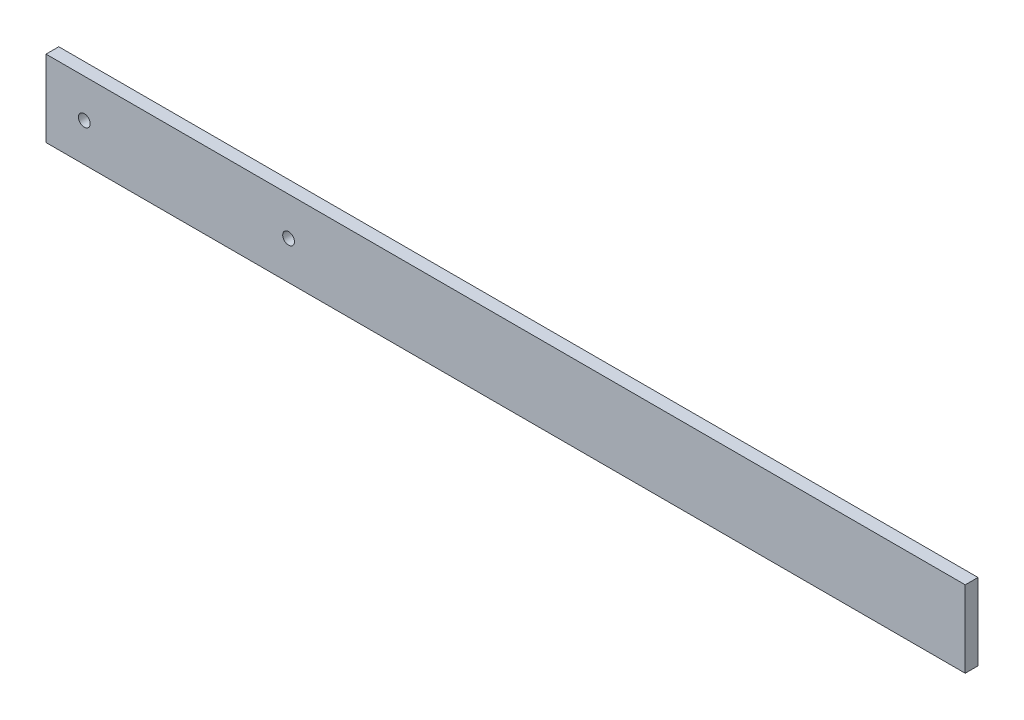
ISO-10303-21;
HEADER;
FILE_DESCRIPTION(('STEP AP214'),'2;1');
FILE_NAME('part.step','',(''),(''),'','','');
FILE_SCHEMA(('AUTOMOTIVE_DESIGN { 1 0 10303 214 1 1 1 1 }'));
ENDSEC;
DATA;
#1=APPLICATION_CONTEXT('core data for automotive mechanical design processes');
#2=APPLICATION_PROTOCOL_DEFINITION('international standard','automotive_design',2000,#1);
#3=PRODUCT_CONTEXT('',#1,'mechanical');
#4=PRODUCT('Part','Part','',(#3));
#5=PRODUCT_RELATED_PRODUCT_CATEGORY('part','',(#4));
#6=PRODUCT_DEFINITION_FORMATION('','',#4);
#7=PRODUCT_DEFINITION_CONTEXT('part definition',#1,'design');
#8=PRODUCT_DEFINITION('design','',#6,#7);
#9=PRODUCT_DEFINITION_SHAPE('','',#8);
#10=(LENGTH_UNIT() NAMED_UNIT(*) SI_UNIT(.MILLI.,.METRE.));
#11=(NAMED_UNIT(*) PLANE_ANGLE_UNIT() SI_UNIT($,.RADIAN.));
#12=(NAMED_UNIT(*) SI_UNIT($,.STERADIAN.) SOLID_ANGLE_UNIT());
#13=UNCERTAINTY_MEASURE_WITH_UNIT(LENGTH_MEASURE(1.E-05),#10,'distance_accuracy_value','');
#14=(GEOMETRIC_REPRESENTATION_CONTEXT(3) GLOBAL_UNCERTAINTY_ASSIGNED_CONTEXT((#13)) GLOBAL_UNIT_ASSIGNED_CONTEXT((#10,
#11,#12)) REPRESENTATION_CONTEXT('',''));
#15=CARTESIAN_POINT('',(0.,0.,0.));
#16=DIRECTION('',(0.,0.,1.));
#17=DIRECTION('',(1.,0.,0.));
#18=AXIS2_PLACEMENT_3D('',#15,#16,#17);
#19=CARTESIAN_POINT('',(0.,0.,3.175));
#20=DIRECTION('',(1.,0.,0.));
#21=DIRECTION('',(0.,0.,-1.));
#22=AXIS2_PLACEMENT_3D('',#19,#20,#21);
#23=PLANE('',#22);
#24=DIRECTION('',(0.,-1.,0.));
#25=VECTOR('',#24,1.);
#26=CARTESIAN_POINT('',(0.,0.,0.));
#27=LINE('',#26,#25);
#28=CARTESIAN_POINT('',(0.,19.05,0.));
#29=VERTEX_POINT('',#28);
#30=CARTESIAN_POINT('',(0.,0.,0.));
#31=VERTEX_POINT('',#30);
#32=EDGE_CURVE('E111',#29,#31,#27,.T.);
#33=ORIENTED_EDGE('',*,*,#32,.T.);
#34=DIRECTION('',(0.,0.,-1.));
#35=VECTOR('',#34,1.);
#36=CARTESIAN_POINT('',(0.,0.,3.175));
#37=LINE('',#36,#35);
#38=CARTESIAN_POINT('',(0.,0.,3.175));
#39=VERTEX_POINT('',#38);
#40=EDGE_CURVE('E11',#39,#31,#37,.T.);
#41=ORIENTED_EDGE('',*,*,#40,.F.);
#42=DIRECTION('',(0.,-1.,0.));
#43=VECTOR('',#42,1.);
#44=CARTESIAN_POINT('',(0.,0.,3.175));
#45=LINE('',#44,#43);
#46=CARTESIAN_POINT('',(0.,19.05,3.175));
#47=VERTEX_POINT('',#46);
#48=EDGE_CURVE('E95',#47,#39,#45,.T.);
#49=ORIENTED_EDGE('',*,*,#48,.F.);
#50=DIRECTION('',(0.,0.,-1.));
#51=VECTOR('',#50,1.);
#52=CARTESIAN_POINT('',(0.,19.05,3.175));
#53=LINE('',#52,#51);
#54=EDGE_CURVE('E107',#47,#29,#53,.T.);
#55=ORIENTED_EDGE('',*,*,#54,.T.);
#56=EDGE_LOOP('',(#33,#41,#49,#55));
#57=FACE_BOUND('',#56,.T.);
#58=ADVANCED_FACE('F43',(#57),#23,.F.);
#59=CARTESIAN_POINT('',(0.,0.,3.175));
#60=DIRECTION('',(0.,1.,0.));
#61=DIRECTION('',(0.,0.,1.));
#62=AXIS2_PLACEMENT_3D('',#59,#60,#61);
#63=PLANE('',#62);
#64=DIRECTION('',(1.,0.,0.));
#65=VECTOR('',#64,1.);
#66=CARTESIAN_POINT('',(0.,0.,0.));
#67=LINE('',#66,#65);
#68=CARTESIAN_POINT('',(228.6,0.,0.));
#69=VERTEX_POINT('',#68);
#70=EDGE_CURVE('E100',#31,#69,#67,.T.);
#71=ORIENTED_EDGE('',*,*,#70,.T.);
#72=DIRECTION('',(0.,0.,-1.));
#73=VECTOR('',#72,1.);
#74=CARTESIAN_POINT('',(228.6,0.,3.175));
#75=LINE('',#74,#73);
#76=CARTESIAN_POINT('',(228.6,0.,3.175));
#77=VERTEX_POINT('',#76);
#78=EDGE_CURVE('E52',#77,#69,#75,.T.);
#79=ORIENTED_EDGE('',*,*,#78,.F.);
#80=DIRECTION('',(1.,0.,0.));
#81=VECTOR('',#80,1.);
#82=CARTESIAN_POINT('',(0.,0.,3.175));
#83=LINE('',#82,#81);
#84=EDGE_CURVE('E90',#39,#77,#83,.T.);
#85=ORIENTED_EDGE('',*,*,#84,.F.);
#86=ORIENTED_EDGE('',*,*,#40,.T.);
#87=EDGE_LOOP('',(#71,#79,#85,#86));
#88=FACE_BOUND('',#87,.T.);
#89=ADVANCED_FACE('F99',(#88),#63,.F.);
#90=CARTESIAN_POINT('',(228.6,0.,3.175));
#91=DIRECTION('',(-1.,0.,0.));
#92=DIRECTION('',(0.,0.,1.));
#93=AXIS2_PLACEMENT_3D('',#90,#91,#92);
#94=PLANE('',#93);
#95=DIRECTION('',(0.,1.,0.));
#96=VECTOR('',#95,1.);
#97=CARTESIAN_POINT('',(228.6,0.,0.));
#98=LINE('',#97,#96);
#99=CARTESIAN_POINT('',(228.6,19.05,0.));
#100=VERTEX_POINT('',#99);
#101=EDGE_CURVE('E77',#69,#100,#98,.T.);
#102=ORIENTED_EDGE('',*,*,#101,.T.);
#103=DIRECTION('',(0.,0.,-1.));
#104=VECTOR('',#103,1.);
#105=CARTESIAN_POINT('',(228.6,19.05,3.175));
#106=LINE('',#105,#104);
#107=CARTESIAN_POINT('',(228.6,19.05,3.175));
#108=VERTEX_POINT('',#107);
#109=EDGE_CURVE('E102',#108,#100,#106,.T.);
#110=ORIENTED_EDGE('',*,*,#109,.F.);
#111=DIRECTION('',(0.,1.,0.));
#112=VECTOR('',#111,1.);
#113=CARTESIAN_POINT('',(228.6,0.,3.175));
#114=LINE('',#113,#112);
#115=EDGE_CURVE('E93',#77,#108,#114,.T.);
#116=ORIENTED_EDGE('',*,*,#115,.F.);
#117=ORIENTED_EDGE('',*,*,#78,.T.);
#118=EDGE_LOOP('',(#102,#110,#116,#117));
#119=FACE_BOUND('',#118,.T.);
#120=ADVANCED_FACE('F103',(#119),#94,.F.);
#121=CARTESIAN_POINT('',(0.,19.05,3.175));
#122=DIRECTION('',(0.,-1.,0.));
#123=DIRECTION('',(0.,0.,-1.));
#124=AXIS2_PLACEMENT_3D('',#121,#122,#123);
#125=PLANE('',#124);
#126=DIRECTION('',(-1.,0.,0.));
#127=VECTOR('',#126,1.);
#128=CARTESIAN_POINT('',(0.,19.05,0.));
#129=LINE('',#128,#127);
#130=EDGE_CURVE('E83',#100,#29,#129,.T.);
#131=ORIENTED_EDGE('',*,*,#130,.T.);
#132=ORIENTED_EDGE('',*,*,#54,.F.);
#133=DIRECTION('',(-1.,0.,0.));
#134=VECTOR('',#133,1.);
#135=CARTESIAN_POINT('',(0.,19.05,3.175));
#136=LINE('',#135,#134);
#137=EDGE_CURVE('E60',#108,#47,#136,.T.);
#138=ORIENTED_EDGE('',*,*,#137,.F.);
#139=ORIENTED_EDGE('',*,*,#109,.T.);
#140=EDGE_LOOP('',(#131,#132,#138,#139));
#141=FACE_BOUND('',#140,.T.);
#142=ADVANCED_FACE('F125',(#141),#125,.F.);
#143=CARTESIAN_POINT('',(0.,0.,3.175));
#144=DIRECTION('',(0.,0.,-1.));
#145=DIRECTION('',(-1.,0.,0.));
#146=AXIS2_PLACEMENT_3D('',#143,#144,#145);
#147=PLANE('',#146);
#148=CARTESIAN_POINT('',(9.525,9.525,3.175));
#149=DIRECTION('',(0.,0.,1.));
#150=DIRECTION('',(1.,0.,0.));
#151=AXIS2_PLACEMENT_3D('',#148,#149,#150);
#152=CIRCLE('',#151,1.4605);
#153=CARTESIAN_POINT('',(10.9855,9.525,3.175));
#154=VERTEX_POINT('',#153);
#155=EDGE_CURVE('E140',#154,#154,#152,.T.);
#156=ORIENTED_EDGE('',*,*,#155,.F.);
#157=EDGE_LOOP('',(#156));
#158=FACE_BOUND('',#157,.T.);
#159=CARTESIAN_POINT('',(60.325,9.525,3.175));
#160=DIRECTION('',(0.,0.,1.));
#161=DIRECTION('',(1.,0.,0.));
#162=AXIS2_PLACEMENT_3D('',#159,#160,#161);
#163=CIRCLE('',#162,1.4605);
#164=CARTESIAN_POINT('',(61.7855,9.525,3.175));
#165=VERTEX_POINT('',#164);
#166=EDGE_CURVE('E136',#165,#165,#163,.T.);
#167=ORIENTED_EDGE('',*,*,#166,.F.);
#168=EDGE_LOOP('',(#167));
#169=FACE_BOUND('',#168,.T.);
#170=ORIENTED_EDGE('',*,*,#48,.T.);
#171=ORIENTED_EDGE('',*,*,#84,.T.);
#172=ORIENTED_EDGE('',*,*,#115,.T.);
#173=ORIENTED_EDGE('',*,*,#137,.T.);
#174=EDGE_LOOP('',(#170,#171,#172,#173));
#175=FACE_BOUND('',#174,.T.);
#176=ADVANCED_FACE('F91',(#158,#169,#175),#147,.F.);
#177=CARTESIAN_POINT('',(0.,0.,0.));
#178=DIRECTION('',(0.,0.,-1.));
#179=DIRECTION('',(-1.,0.,0.));
#180=AXIS2_PLACEMENT_3D('',#177,#178,#179);
#181=PLANE('',#180);
#182=CARTESIAN_POINT('',(9.525,9.525,0.));
#183=DIRECTION('',(0.,0.,1.));
#184=DIRECTION('',(1.,0.,0.));
#185=AXIS2_PLACEMENT_3D('',#182,#183,#184);
#186=CIRCLE('',#185,1.4605);
#187=CARTESIAN_POINT('',(10.9855,9.525,0.));
#188=VERTEX_POINT('',#187);
#189=EDGE_CURVE('E115',#188,#188,#186,.T.);
#190=ORIENTED_EDGE('',*,*,#189,.T.);
#191=EDGE_LOOP('',(#190));
#192=FACE_BOUND('',#191,.T.);
#193=CARTESIAN_POINT('',(60.325,9.525,0.));
#194=DIRECTION('',(0.,0.,1.));
#195=DIRECTION('',(1.,0.,0.));
#196=AXIS2_PLACEMENT_3D('',#193,#194,#195);
#197=CIRCLE('',#196,1.4605);
#198=CARTESIAN_POINT('',(61.7855,9.525,0.));
#199=VERTEX_POINT('',#198);
#200=EDGE_CURVE('E132',#199,#199,#197,.T.);
#201=ORIENTED_EDGE('',*,*,#200,.T.);
#202=EDGE_LOOP('',(#201));
#203=FACE_BOUND('',#202,.T.);
#204=ORIENTED_EDGE('',*,*,#32,.F.);
#205=ORIENTED_EDGE('',*,*,#130,.F.);
#206=ORIENTED_EDGE('',*,*,#101,.F.);
#207=ORIENTED_EDGE('',*,*,#70,.F.);
#208=EDGE_LOOP('',(#204,#205,#206,#207));
#209=FACE_BOUND('',#208,.T.);
#210=ADVANCED_FACE('F128',(#192,#203,#209),#181,.T.);
#211=CARTESIAN_POINT('',(60.325,9.525,0.));
#212=DIRECTION('',(0.,0.,1.));
#213=DIRECTION('',(1.,0.,0.));
#214=AXIS2_PLACEMENT_3D('',#211,#212,#213);
#215=CYLINDRICAL_SURFACE('',#214,1.4605);
#216=ORIENTED_EDGE('',*,*,#200,.F.);
#217=EDGE_LOOP('',(#216));
#218=FACE_BOUND('',#217,.T.);
#219=ORIENTED_EDGE('',*,*,#166,.T.);
#220=EDGE_LOOP('',(#219));
#221=FACE_BOUND('',#220,.T.);
#222=ADVANCED_FACE('F153',(#218,#221),#215,.F.);
#223=CARTESIAN_POINT('',(9.525,9.525,0.));
#224=DIRECTION('',(0.,0.,1.));
#225=DIRECTION('',(1.,0.,0.));
#226=AXIS2_PLACEMENT_3D('',#223,#224,#225);
#227=CYLINDRICAL_SURFACE('',#226,1.4605);
#228=ORIENTED_EDGE('',*,*,#189,.F.);
#229=EDGE_LOOP('',(#228));
#230=FACE_BOUND('',#229,.T.);
#231=ORIENTED_EDGE('',*,*,#155,.T.);
#232=EDGE_LOOP('',(#231));
#233=FACE_BOUND('',#232,.T.);
#234=ADVANCED_FACE('F150',(#230,#233),#227,.F.);
#235=CLOSED_SHELL('',(#58,#89,#120,#142,#176,#210,#222,#234));
#236=MANIFOLD_SOLID_BREP('B2',#235);
#237=ADVANCED_BREP_SHAPE_REPRESENTATION('',(#18,#236),#14);
#238=SHAPE_DEFINITION_REPRESENTATION(#9,#237);
ENDSEC;
END-ISO-10303-21;
